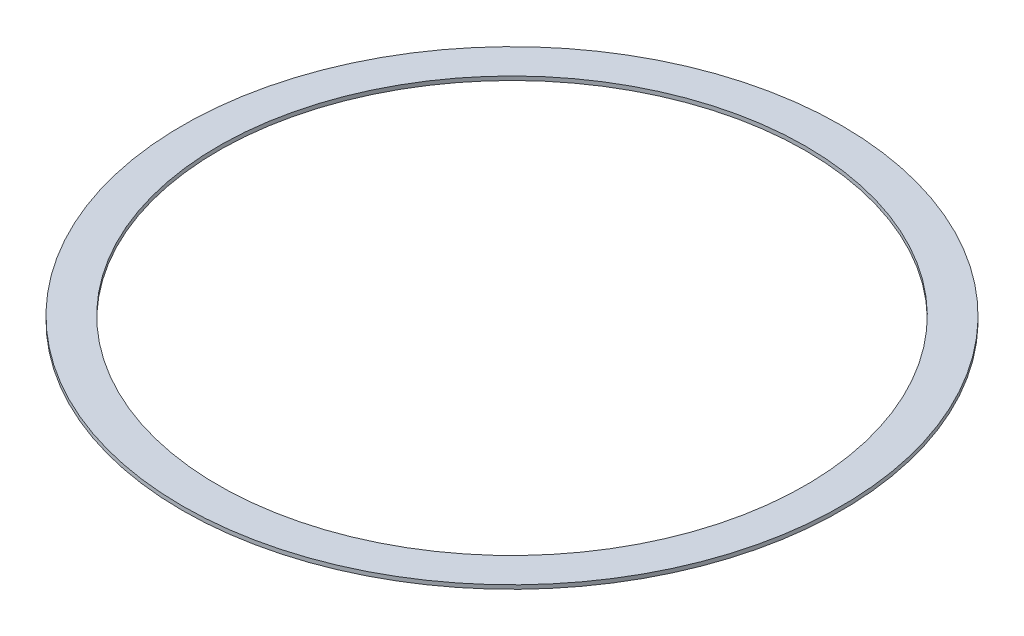
ISO-10303-21;
HEADER;
FILE_DESCRIPTION(('STEP AP214'),'2;1');
FILE_NAME('part.step','',(''),(''),'','','');
FILE_SCHEMA(('AUTOMOTIVE_DESIGN { 1 0 10303 214 1 1 1 1 }'));
ENDSEC;
DATA;
#1=APPLICATION_CONTEXT('core data for automotive mechanical design processes');
#2=APPLICATION_PROTOCOL_DEFINITION('international standard','automotive_design',2000,#1);
#3=PRODUCT_CONTEXT('',#1,'mechanical');
#4=PRODUCT('Part','Part','',(#3));
#5=PRODUCT_RELATED_PRODUCT_CATEGORY('part','',(#4));
#6=PRODUCT_DEFINITION_FORMATION('','',#4);
#7=PRODUCT_DEFINITION_CONTEXT('part definition',#1,'design');
#8=PRODUCT_DEFINITION('design','',#6,#7);
#9=PRODUCT_DEFINITION_SHAPE('','',#8);
#10=(LENGTH_UNIT() NAMED_UNIT(*) SI_UNIT(.MILLI.,.METRE.));
#11=(NAMED_UNIT(*) PLANE_ANGLE_UNIT() SI_UNIT($,.RADIAN.));
#12=(NAMED_UNIT(*) SI_UNIT($,.STERADIAN.) SOLID_ANGLE_UNIT());
#13=UNCERTAINTY_MEASURE_WITH_UNIT(LENGTH_MEASURE(1.E-05),#10,'distance_accuracy_value','');
#14=(GEOMETRIC_REPRESENTATION_CONTEXT(3) GLOBAL_UNCERTAINTY_ASSIGNED_CONTEXT((#13)) GLOBAL_UNIT_ASSIGNED_CONTEXT((#10,
#11,#12)) REPRESENTATION_CONTEXT('',''));
#15=CARTESIAN_POINT('',(0.,0.,0.));
#16=DIRECTION('',(0.,0.,1.));
#17=DIRECTION('',(1.,0.,0.));
#18=AXIS2_PLACEMENT_3D('',#15,#16,#17);
#19=CARTESIAN_POINT('',(0.,0.762,0.));
#20=DIRECTION('',(0.,-1.,0.));
#21=DIRECTION('',(0.,0.,-1.));
#22=AXIS2_PLACEMENT_3D('',#19,#20,#21);
#23=CYLINDRICAL_SURFACE('',#22,57.15);
#24=CARTESIAN_POINT('',(0.,0.762,0.));
#25=DIRECTION('',(0.,1.,0.));
#26=DIRECTION('',(0.,0.,1.));
#27=AXIS2_PLACEMENT_3D('',#24,#25,#26);
#28=CIRCLE('',#27,57.15);
#29=CARTESIAN_POINT('',(0.,0.762,-57.15));
#30=VERTEX_POINT('',#29);
#31=EDGE_CURVE('E50',#30,#30,#28,.T.);
#32=CARTESIAN_POINT('',(0.,0.,0.));
#33=DIRECTION('',(0.,1.,0.));
#34=DIRECTION('',(0.,0.,1.));
#35=AXIS2_PLACEMENT_3D('',#32,#33,#34);
#36=CIRCLE('',#35,57.15);
#37=CARTESIAN_POINT('',(0.,0.,-57.15));
#38=VERTEX_POINT('',#37);
#39=EDGE_CURVE('E57',#38,#38,#36,.T.);
#40=CARTESIAN_POINT('',(0.,0.762,-57.15));
#41=CARTESIAN_POINT('',(0.,0.7540625,-57.15));
#42=CARTESIAN_POINT('',(0.,0.746125,-57.15));
#43=CARTESIAN_POINT('',(0.,0.73025,-57.15));
#44=CARTESIAN_POINT('',(0.,0.7223125,-57.15));
#45=CARTESIAN_POINT('',(0.,0.7064375,-57.15));
#46=CARTESIAN_POINT('',(0.,0.6985,-57.15));
#47=CARTESIAN_POINT('',(0.,0.682625,-57.15));
#48=CARTESIAN_POINT('',(0.,0.6746875,-57.15));
#49=CARTESIAN_POINT('',(0.,0.6588125,-57.15));
#50=CARTESIAN_POINT('',(0.,0.650875,-57.15));
#51=CARTESIAN_POINT('',(0.,0.635,-57.15));
#52=CARTESIAN_POINT('',(0.,0.6270625,-57.15));
#53=CARTESIAN_POINT('',(0.,0.6111875,-57.15));
#54=CARTESIAN_POINT('',(0.,0.60325,-57.15));
#55=CARTESIAN_POINT('',(0.,0.587375,-57.15));
#56=CARTESIAN_POINT('',(0.,0.5794375,-57.15));
#57=CARTESIAN_POINT('',(0.,0.5635625,-57.15));
#58=CARTESIAN_POINT('',(0.,0.555625,-57.15));
#59=CARTESIAN_POINT('',(0.,0.53975,-57.15));
#60=CARTESIAN_POINT('',(0.,0.5318125,-57.15));
#61=CARTESIAN_POINT('',(0.,0.5159375,-57.15));
#62=CARTESIAN_POINT('',(0.,0.508,-57.15));
#63=CARTESIAN_POINT('',(0.,0.492125,-57.15));
#64=CARTESIAN_POINT('',(0.,0.4841875,-57.15));
#65=CARTESIAN_POINT('',(0.,0.4683125,-57.15));
#66=CARTESIAN_POINT('',(0.,0.460375,-57.15));
#67=CARTESIAN_POINT('',(0.,0.4445,-57.15));
#68=CARTESIAN_POINT('',(0.,0.4365625,-57.15));
#69=CARTESIAN_POINT('',(0.,0.4206875,-57.15));
#70=CARTESIAN_POINT('',(0.,0.41275,-57.15));
#71=CARTESIAN_POINT('',(0.,0.396875,-57.15));
#72=CARTESIAN_POINT('',(0.,0.3889375,-57.15));
#73=CARTESIAN_POINT('',(0.,0.3730625,-57.15));
#74=CARTESIAN_POINT('',(0.,0.365125,-57.15));
#75=CARTESIAN_POINT('',(0.,0.34925,-57.15));
#76=CARTESIAN_POINT('',(0.,0.3413125,-57.15));
#77=CARTESIAN_POINT('',(0.,0.3254375,-57.15));
#78=CARTESIAN_POINT('',(0.,0.3175,-57.15));
#79=CARTESIAN_POINT('',(0.,0.301625,-57.15));
#80=CARTESIAN_POINT('',(0.,0.2936875,-57.15));
#81=CARTESIAN_POINT('',(0.,0.2778125,-57.15));
#82=CARTESIAN_POINT('',(0.,0.269875,-57.15));
#83=CARTESIAN_POINT('',(0.,0.254,-57.15));
#84=CARTESIAN_POINT('',(0.,0.2460625,-57.15));
#85=CARTESIAN_POINT('',(0.,0.2301875,-57.15));
#86=CARTESIAN_POINT('',(0.,0.22225,-57.15));
#87=CARTESIAN_POINT('',(0.,0.206375,-57.15));
#88=CARTESIAN_POINT('',(0.,0.1984375,-57.15));
#89=CARTESIAN_POINT('',(0.,0.1825625,-57.15));
#90=CARTESIAN_POINT('',(0.,0.174625,-57.15));
#91=CARTESIAN_POINT('',(0.,0.15875,-57.15));
#92=CARTESIAN_POINT('',(0.,0.1508125,-57.15));
#93=CARTESIAN_POINT('',(0.,0.1349375,-57.15));
#94=CARTESIAN_POINT('',(0.,0.127,-57.15));
#95=CARTESIAN_POINT('',(0.,0.111125,-57.15));
#96=CARTESIAN_POINT('',(0.,0.1031875,-57.15));
#97=CARTESIAN_POINT('',(0.,0.0873125,-57.15));
#98=CARTESIAN_POINT('',(0.,0.079375,-57.15));
#99=CARTESIAN_POINT('',(0.,0.0635,-57.15));
#100=CARTESIAN_POINT('',(0.,0.0555625,-57.15));
#101=CARTESIAN_POINT('',(0.,0.0396875,-57.15));
#102=CARTESIAN_POINT('',(0.,0.03175,-57.15));
#103=CARTESIAN_POINT('',(0.,0.015875,-57.15));
#104=CARTESIAN_POINT('',(0.,0.00793749999999999,-57.15));
#105=CARTESIAN_POINT('',(0.,0.,-57.15));
#106=B_SPLINE_CURVE_WITH_KNOTS('',3,(#40,#41,#42,#43,#44,#45,#46,#47,#48,#49,#50,#51,#52,#53,
#54,#55,#56,#57,#58,#59,#60,#61,#62,#63,#64,#65,#66,#67,#68,#69,#70,#71,#72,#73,#74,#75,#76,#77,
#78,#79,#80,#81,#82,#83,#84,#85,#86,#87,#88,#89,#90,#91,#92,#93,#94,#95,#96,#97,#98,#99,#100,
#101,#102,#103,#104,#105),.UNSPECIFIED.,.F.,.F.,(4,2,2,2,2,2,2,2,2,2,2,2,2,2,2,2,2,2,2,2,2,2,2,
2,2,2,2,2,2,2,2,2,4),(0.,0.0238125000000001,0.047625,0.0714375,0.0952500000000001,0.1190625,
0.142875,0.1666875,0.1905,0.2143125,0.238125,0.2619375,0.28575,0.3095625,0.333375,0.3571875,
0.381,0.4048125,0.428625,0.4524375,0.47625,0.5000625,0.523875,0.5476875,0.5715,0.5953125,
0.619125,0.6429375,0.66675,0.6905625,0.714375,0.7381875,0.762),.UNSPECIFIED.);
#107=EDGE_CURVE('BSEAM42',#30,#38,#106,.T.);
#108=ORIENTED_EDGE('',*,*,#31,.T.);
#109=ORIENTED_EDGE('',*,*,#39,.F.);
#110=ORIENTED_EDGE('',*,*,#107,.T.);
#111=ORIENTED_EDGE('',*,*,#107,.F.);
#112=EDGE_LOOP('',(#108,#110,#109,#111));
#113=FACE_BOUND('',#112,.T.);
#114=ADVANCED_FACE('F42',(#113),#23,.F.);
#115=CARTESIAN_POINT('',(0.,0.762,0.));
#116=DIRECTION('',(0.,-1.,0.));
#117=DIRECTION('',(0.,0.,-1.));
#118=AXIS2_PLACEMENT_3D('',#115,#116,#117);
#119=CYLINDRICAL_SURFACE('',#118,64.135);
#120=CARTESIAN_POINT('',(0.,0.762,0.));
#121=DIRECTION('',(0.,1.,0.));
#122=DIRECTION('',(0.,0.,1.));
#123=AXIS2_PLACEMENT_3D('',#120,#121,#122);
#124=CIRCLE('',#123,64.135);
#125=CARTESIAN_POINT('',(0.,0.762,-64.135));
#126=VERTEX_POINT('',#125);
#127=EDGE_CURVE('E10',#126,#126,#124,.T.);
#128=CARTESIAN_POINT('',(0.,0.,0.));
#129=DIRECTION('',(0.,1.,0.));
#130=DIRECTION('',(0.,0.,1.));
#131=AXIS2_PLACEMENT_3D('',#128,#129,#130);
#132=CIRCLE('',#131,64.135);
#133=CARTESIAN_POINT('',(0.,0.,-64.135));
#134=VERTEX_POINT('',#133);
#135=EDGE_CURVE('E45',#134,#134,#132,.T.);
#136=CARTESIAN_POINT('',(0.,0.762,-64.135));
#137=CARTESIAN_POINT('',(0.,0.7540625,-64.135));
#138=CARTESIAN_POINT('',(0.,0.746125,-64.135));
#139=CARTESIAN_POINT('',(0.,0.73025,-64.135));
#140=CARTESIAN_POINT('',(0.,0.7223125,-64.135));
#141=CARTESIAN_POINT('',(0.,0.7064375,-64.135));
#142=CARTESIAN_POINT('',(0.,0.6985,-64.135));
#143=CARTESIAN_POINT('',(0.,0.682625,-64.135));
#144=CARTESIAN_POINT('',(0.,0.6746875,-64.135));
#145=CARTESIAN_POINT('',(0.,0.6588125,-64.135));
#146=CARTESIAN_POINT('',(0.,0.650875,-64.135));
#147=CARTESIAN_POINT('',(0.,0.635,-64.135));
#148=CARTESIAN_POINT('',(0.,0.6270625,-64.135));
#149=CARTESIAN_POINT('',(0.,0.6111875,-64.135));
#150=CARTESIAN_POINT('',(0.,0.60325,-64.135));
#151=CARTESIAN_POINT('',(0.,0.587375,-64.135));
#152=CARTESIAN_POINT('',(0.,0.5794375,-64.135));
#153=CARTESIAN_POINT('',(0.,0.5635625,-64.135));
#154=CARTESIAN_POINT('',(0.,0.555625,-64.135));
#155=CARTESIAN_POINT('',(0.,0.53975,-64.135));
#156=CARTESIAN_POINT('',(0.,0.5318125,-64.135));
#157=CARTESIAN_POINT('',(0.,0.5159375,-64.135));
#158=CARTESIAN_POINT('',(0.,0.508,-64.135));
#159=CARTESIAN_POINT('',(0.,0.492125,-64.135));
#160=CARTESIAN_POINT('',(0.,0.4841875,-64.135));
#161=CARTESIAN_POINT('',(0.,0.4683125,-64.135));
#162=CARTESIAN_POINT('',(0.,0.460375,-64.135));
#163=CARTESIAN_POINT('',(0.,0.4445,-64.135));
#164=CARTESIAN_POINT('',(0.,0.4365625,-64.135));
#165=CARTESIAN_POINT('',(0.,0.4206875,-64.135));
#166=CARTESIAN_POINT('',(0.,0.41275,-64.135));
#167=CARTESIAN_POINT('',(0.,0.396875,-64.135));
#168=CARTESIAN_POINT('',(0.,0.3889375,-64.135));
#169=CARTESIAN_POINT('',(0.,0.3730625,-64.135));
#170=CARTESIAN_POINT('',(0.,0.365125,-64.135));
#171=CARTESIAN_POINT('',(0.,0.34925,-64.135));
#172=CARTESIAN_POINT('',(0.,0.3413125,-64.135));
#173=CARTESIAN_POINT('',(0.,0.3254375,-64.135));
#174=CARTESIAN_POINT('',(0.,0.3175,-64.135));
#175=CARTESIAN_POINT('',(0.,0.301625,-64.135));
#176=CARTESIAN_POINT('',(0.,0.2936875,-64.135));
#177=CARTESIAN_POINT('',(0.,0.2778125,-64.135));
#178=CARTESIAN_POINT('',(0.,0.269875,-64.135));
#179=CARTESIAN_POINT('',(0.,0.254,-64.135));
#180=CARTESIAN_POINT('',(0.,0.2460625,-64.135));
#181=CARTESIAN_POINT('',(0.,0.2301875,-64.135));
#182=CARTESIAN_POINT('',(0.,0.22225,-64.135));
#183=CARTESIAN_POINT('',(0.,0.206375,-64.135));
#184=CARTESIAN_POINT('',(0.,0.1984375,-64.135));
#185=CARTESIAN_POINT('',(0.,0.1825625,-64.135));
#186=CARTESIAN_POINT('',(0.,0.174625,-64.135));
#187=CARTESIAN_POINT('',(0.,0.15875,-64.135));
#188=CARTESIAN_POINT('',(0.,0.1508125,-64.135));
#189=CARTESIAN_POINT('',(0.,0.1349375,-64.135));
#190=CARTESIAN_POINT('',(0.,0.127,-64.135));
#191=CARTESIAN_POINT('',(0.,0.111125,-64.135));
#192=CARTESIAN_POINT('',(0.,0.1031875,-64.135));
#193=CARTESIAN_POINT('',(0.,0.0873125,-64.135));
#194=CARTESIAN_POINT('',(0.,0.079375,-64.135));
#195=CARTESIAN_POINT('',(0.,0.0635,-64.135));
#196=CARTESIAN_POINT('',(0.,0.0555625,-64.135));
#197=CARTESIAN_POINT('',(0.,0.0396875,-64.135));
#198=CARTESIAN_POINT('',(0.,0.03175,-64.135));
#199=CARTESIAN_POINT('',(0.,0.015875,-64.135));
#200=CARTESIAN_POINT('',(0.,0.00793749999999999,-64.135));
#201=CARTESIAN_POINT('',(0.,0.,-64.135));
#202=B_SPLINE_CURVE_WITH_KNOTS('',3,(#136,#137,#138,#139,#140,#141,#142,#143,#144,#145,#146,
#147,#148,#149,#150,#151,#152,#153,#154,#155,#156,#157,#158,#159,#160,#161,#162,#163,#164,#165,
#166,#167,#168,#169,#170,#171,#172,#173,#174,#175,#176,#177,#178,#179,#180,#181,#182,#183,#184,
#185,#186,#187,#188,#189,#190,#191,#192,#193,#194,#195,#196,#197,#198,#199,#200,#201),
.UNSPECIFIED.,.F.,.F.,(4,2,2,2,2,2,2,2,2,2,2,2,2,2,2,2,2,2,2,2,2,2,2,2,2,2,2,2,2,2,2,2,4),(0.,
0.0238125000000001,0.047625,0.0714375,0.0952500000000001,0.1190625,0.142875,0.1666875,0.1905,
0.2143125,0.238125,0.2619375,0.28575,0.3095625,0.333375,0.3571875,0.381,0.4048125,0.428625,
0.4524375,0.47625,0.5000625,0.523875,0.5476875,0.5715,0.5953125,0.619125,0.6429375,0.66675,
0.6905625,0.714375,0.7381875,0.762),.UNSPECIFIED.);
#203=EDGE_CURVE('BSEAM66',#126,#134,#202,.T.);
#204=ORIENTED_EDGE('',*,*,#127,.F.);
#205=ORIENTED_EDGE('',*,*,#135,.T.);
#206=ORIENTED_EDGE('',*,*,#203,.T.);
#207=ORIENTED_EDGE('',*,*,#203,.F.);
#208=EDGE_LOOP('',(#204,#206,#205,#207));
#209=FACE_BOUND('',#208,.T.);
#210=ADVANCED_FACE('F66',(#209),#119,.T.);
#211=CARTESIAN_POINT('',(0.,0.762,0.));
#212=DIRECTION('',(0.,1.,0.));
#213=DIRECTION('',(0.,0.,1.));
#214=AXIS2_PLACEMENT_3D('',#211,#212,#213);
#215=PLANE('',#214);
#216=ORIENTED_EDGE('',*,*,#31,.F.);
#217=EDGE_LOOP('',(#216));
#218=FACE_BOUND('',#217,.T.);
#219=ORIENTED_EDGE('',*,*,#127,.T.);
#220=EDGE_LOOP('',(#219));
#221=FACE_BOUND('',#220,.T.);
#222=ADVANCED_FACE('F70',(#218,#221),#215,.T.);
#223=CARTESIAN_POINT('',(0.,0.,0.));
#224=DIRECTION('',(0.,1.,0.));
#225=DIRECTION('',(0.,0.,1.));
#226=AXIS2_PLACEMENT_3D('',#223,#224,#225);
#227=PLANE('',#226);
#228=ORIENTED_EDGE('',*,*,#39,.T.);
#229=EDGE_LOOP('',(#228));
#230=FACE_BOUND('',#229,.T.);
#231=ORIENTED_EDGE('',*,*,#135,.F.);
#232=EDGE_LOOP('',(#231));
#233=FACE_BOUND('',#232,.T.);
#234=ADVANCED_FACE('F68',(#230,#233),#227,.F.);
#235=CLOSED_SHELL('',(#114,#210,#222,#234));
#236=MANIFOLD_SOLID_BREP('B2',#235);
#237=ADVANCED_BREP_SHAPE_REPRESENTATION('',(#18,#236),#14);
#238=SHAPE_DEFINITION_REPRESENTATION(#9,#237);
ENDSEC;
END-ISO-10303-21;
